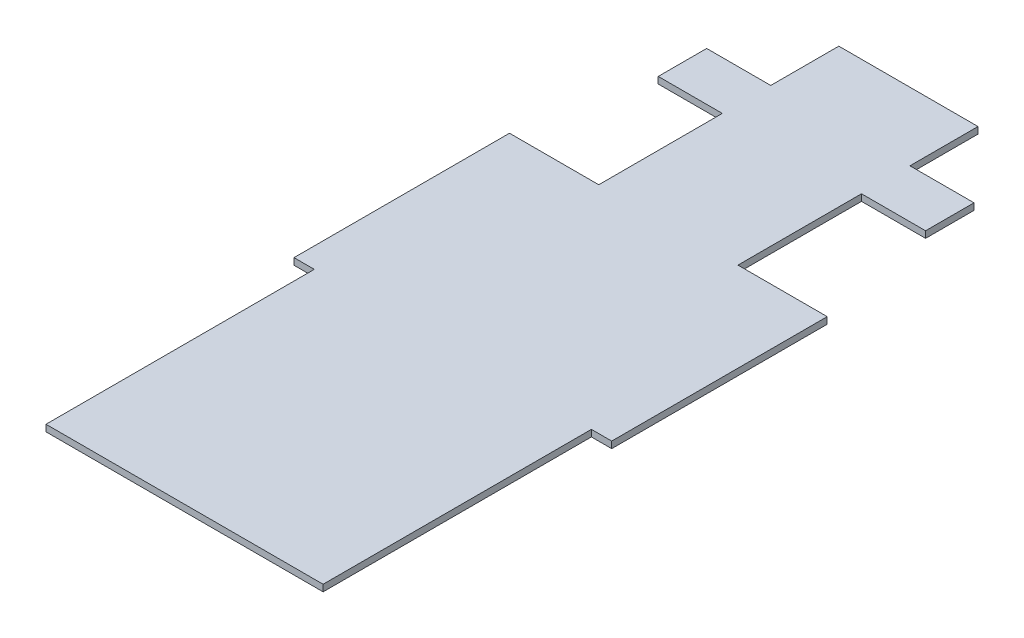
ISO-10303-21;
HEADER;
FILE_DESCRIPTION(('STEP AP214'),'2;1');
FILE_NAME('part.step','',(''),(''),'','','');
FILE_SCHEMA(('AUTOMOTIVE_DESIGN { 1 0 10303 214 1 1 1 1 }'));
ENDSEC;
DATA;
#1=APPLICATION_CONTEXT('core data for automotive mechanical design processes');
#2=APPLICATION_PROTOCOL_DEFINITION('international standard','automotive_design',2000,#1);
#3=PRODUCT_CONTEXT('',#1,'mechanical');
#4=PRODUCT('Part','Part','',(#3));
#5=PRODUCT_RELATED_PRODUCT_CATEGORY('part','',(#4));
#6=PRODUCT_DEFINITION_FORMATION('','',#4);
#7=PRODUCT_DEFINITION_CONTEXT('part definition',#1,'design');
#8=PRODUCT_DEFINITION('design','',#6,#7);
#9=PRODUCT_DEFINITION_SHAPE('','',#8);
#10=(LENGTH_UNIT() NAMED_UNIT(*) SI_UNIT(.MILLI.,.METRE.));
#11=(NAMED_UNIT(*) PLANE_ANGLE_UNIT() SI_UNIT($,.RADIAN.));
#12=(NAMED_UNIT(*) SI_UNIT($,.STERADIAN.) SOLID_ANGLE_UNIT());
#13=UNCERTAINTY_MEASURE_WITH_UNIT(LENGTH_MEASURE(1.E-05),#10,'distance_accuracy_value','');
#14=(GEOMETRIC_REPRESENTATION_CONTEXT(3) GLOBAL_UNCERTAINTY_ASSIGNED_CONTEXT((#13)) GLOBAL_UNIT_ASSIGNED_CONTEXT((#10,
#11,#12)) REPRESENTATION_CONTEXT('',''));
#15=CARTESIAN_POINT('',(0.,0.,0.));
#16=DIRECTION('',(0.,0.,1.));
#17=DIRECTION('',(1.,0.,0.));
#18=AXIS2_PLACEMENT_3D('',#15,#16,#17);
#19=CARTESIAN_POINT('',(-45.,1.87,30.525));
#20=DIRECTION('',(0.,0.,-1.));
#21=DIRECTION('',(-1.,0.,0.));
#22=AXIS2_PLACEMENT_3D('',#19,#20,#21);
#23=PLANE('',#22);
#24=DIRECTION('',(1.,0.,0.));
#25=VECTOR('',#24,1.);
#26=CARTESIAN_POINT('',(-45.,0.,30.525));
#27=LINE('',#26,#25);
#28=CARTESIAN_POINT('',(-45.,0.,30.525));
#29=VERTEX_POINT('',#28);
#30=CARTESIAN_POINT('',(-39.25,0.,30.525));
#31=VERTEX_POINT('',#30);
#32=EDGE_CURVE('E199',#29,#31,#27,.T.);
#33=ORIENTED_EDGE('',*,*,#32,.T.);
#34=DIRECTION('',(0.,-1.,0.));
#35=VECTOR('',#34,1.);
#36=CARTESIAN_POINT('',(-39.25,1.87,30.525));
#37=LINE('',#36,#35);
#38=CARTESIAN_POINT('',(-39.25,1.87,30.525));
#39=VERTEX_POINT('',#38);
#40=EDGE_CURVE('E11',#39,#31,#37,.T.);
#41=ORIENTED_EDGE('',*,*,#40,.F.);
#42=DIRECTION('',(1.,0.,0.));
#43=VECTOR('',#42,1.);
#44=CARTESIAN_POINT('',(-45.,1.87,30.525));
#45=LINE('',#44,#43);
#46=CARTESIAN_POINT('',(-45.,1.87,30.525));
#47=VERTEX_POINT('',#46);
#48=EDGE_CURVE('E122',#47,#39,#45,.T.);
#49=ORIENTED_EDGE('',*,*,#48,.F.);
#50=DIRECTION('',(0.,-1.,0.));
#51=VECTOR('',#50,1.);
#52=CARTESIAN_POINT('',(-45.,1.87,30.525));
#53=LINE('',#52,#51);
#54=EDGE_CURVE('E49',#47,#29,#53,.T.);
#55=ORIENTED_EDGE('',*,*,#54,.T.);
#56=EDGE_LOOP('',(#33,#41,#49,#55));
#57=FACE_BOUND('',#56,.T.);
#58=ADVANCED_FACE('F33',(#57),#23,.F.);
#59=CARTESIAN_POINT('',(-39.25,1.87,106.525));
#60=DIRECTION('',(-1.,0.,0.));
#61=DIRECTION('',(0.,0.,1.));
#62=AXIS2_PLACEMENT_3D('',#59,#60,#61);
#63=PLANE('',#62);
#64=DIRECTION('',(0.,0.,-1.));
#65=VECTOR('',#64,1.);
#66=CARTESIAN_POINT('',(-39.25,0.,106.525));
#67=LINE('',#66,#65);
#68=CARTESIAN_POINT('',(-39.25,0.,106.525));
#69=VERTEX_POINT('',#68);
#70=EDGE_CURVE('E201',#69,#31,#67,.T.);
#71=ORIENTED_EDGE('',*,*,#70,.F.);
#72=DIRECTION('',(0.,-1.,0.));
#73=VECTOR('',#72,1.);
#74=CARTESIAN_POINT('',(-39.25,1.87,106.525));
#75=LINE('',#74,#73);
#76=CARTESIAN_POINT('',(-39.25,1.87,106.525));
#77=VERTEX_POINT('',#76);
#78=EDGE_CURVE('E41',#77,#69,#75,.T.);
#79=ORIENTED_EDGE('',*,*,#78,.F.);
#80=DIRECTION('',(0.,0.,-1.));
#81=VECTOR('',#80,1.);
#82=CARTESIAN_POINT('',(-39.25,1.87,106.525));
#83=LINE('',#82,#81);
#84=EDGE_CURVE('E299',#77,#39,#83,.T.);
#85=ORIENTED_EDGE('',*,*,#84,.T.);
#86=ORIENTED_EDGE('',*,*,#40,.T.);
#87=EDGE_LOOP('',(#71,#79,#85,#86));
#88=FACE_BOUND('',#87,.T.);
#89=ADVANCED_FACE('F298',(#88),#63,.T.);
#90=CARTESIAN_POINT('',(-39.25,1.87,106.525));
#91=DIRECTION('',(0.,0.,-1.));
#92=DIRECTION('',(-1.,0.,0.));
#93=AXIS2_PLACEMENT_3D('',#90,#91,#92);
#94=PLANE('',#93);
#95=DIRECTION('',(1.,0.,0.));
#96=VECTOR('',#95,1.);
#97=CARTESIAN_POINT('',(-39.25,0.,106.525));
#98=LINE('',#97,#96);
#99=CARTESIAN_POINT('',(39.25,0.,106.525));
#100=VERTEX_POINT('',#99);
#101=EDGE_CURVE('E204',#69,#100,#98,.T.);
#102=ORIENTED_EDGE('',*,*,#101,.T.);
#103=DIRECTION('',(0.,-1.,0.));
#104=VECTOR('',#103,1.);
#105=CARTESIAN_POINT('',(39.25,1.87,106.525));
#106=LINE('',#105,#104);
#107=CARTESIAN_POINT('',(39.25,1.87,106.525));
#108=VERTEX_POINT('',#107);
#109=EDGE_CURVE('E283',#108,#100,#106,.T.);
#110=ORIENTED_EDGE('',*,*,#109,.F.);
#111=DIRECTION('',(1.,0.,0.));
#112=VECTOR('',#111,1.);
#113=CARTESIAN_POINT('',(-39.25,1.87,106.525));
#114=LINE('',#113,#112);
#115=EDGE_CURVE('E290',#77,#108,#114,.T.);
#116=ORIENTED_EDGE('',*,*,#115,.F.);
#117=ORIENTED_EDGE('',*,*,#78,.T.);
#118=EDGE_LOOP('',(#102,#110,#116,#117));
#119=FACE_BOUND('',#118,.T.);
#120=ADVANCED_FACE('F288',(#119),#94,.F.);
#121=CARTESIAN_POINT('',(39.25,1.87,106.525));
#122=DIRECTION('',(-1.,0.,0.));
#123=DIRECTION('',(0.,0.,1.));
#124=AXIS2_PLACEMENT_3D('',#121,#122,#123);
#125=PLANE('',#124);
#126=DIRECTION('',(0.,0.,-1.));
#127=VECTOR('',#126,1.);
#128=CARTESIAN_POINT('',(39.25,0.,106.525));
#129=LINE('',#128,#127);
#130=CARTESIAN_POINT('',(39.25,0.,30.525));
#131=VERTEX_POINT('',#130);
#132=EDGE_CURVE('E206',#100,#131,#129,.T.);
#133=ORIENTED_EDGE('',*,*,#132,.T.);
#134=DIRECTION('',(0.,-1.,0.));
#135=VECTOR('',#134,1.);
#136=CARTESIAN_POINT('',(39.25,1.87,30.525));
#137=LINE('',#136,#135);
#138=CARTESIAN_POINT('',(39.25,1.87,30.525));
#139=VERTEX_POINT('',#138);
#140=EDGE_CURVE('E280',#139,#131,#137,.T.);
#141=ORIENTED_EDGE('',*,*,#140,.F.);
#142=DIRECTION('',(0.,0.,-1.));
#143=VECTOR('',#142,1.);
#144=CARTESIAN_POINT('',(39.25,1.87,106.525));
#145=LINE('',#144,#143);
#146=EDGE_CURVE('E550',#108,#139,#145,.T.);
#147=ORIENTED_EDGE('',*,*,#146,.F.);
#148=ORIENTED_EDGE('',*,*,#109,.T.);
#149=EDGE_LOOP('',(#133,#141,#147,#148));
#150=FACE_BOUND('',#149,.T.);
#151=ADVANCED_FACE('F317',(#150),#125,.F.);
#152=CARTESIAN_POINT('',(39.25,1.87,30.525));
#153=DIRECTION('',(0.,0.,-1.));
#154=DIRECTION('',(-1.,0.,0.));
#155=AXIS2_PLACEMENT_3D('',#152,#153,#154);
#156=PLANE('',#155);
#157=DIRECTION('',(1.,0.,0.));
#158=VECTOR('',#157,1.);
#159=CARTESIAN_POINT('',(39.25,0.,30.525));
#160=LINE('',#159,#158);
#161=CARTESIAN_POINT('',(45.,0.,30.525));
#162=VERTEX_POINT('',#161);
#163=EDGE_CURVE('E208',#131,#162,#160,.T.);
#164=ORIENTED_EDGE('',*,*,#163,.T.);
#165=DIRECTION('',(0.,-1.,0.));
#166=VECTOR('',#165,1.);
#167=CARTESIAN_POINT('',(45.,1.87,30.525));
#168=LINE('',#167,#166);
#169=CARTESIAN_POINT('',(45.,1.87,30.525));
#170=VERTEX_POINT('',#169);
#171=EDGE_CURVE('E277',#170,#162,#168,.T.);
#172=ORIENTED_EDGE('',*,*,#171,.F.);
#173=DIRECTION('',(1.,0.,0.));
#174=VECTOR('',#173,1.);
#175=CARTESIAN_POINT('',(39.25,1.87,30.525));
#176=LINE('',#175,#174);
#177=EDGE_CURVE('E547',#139,#170,#176,.T.);
#178=ORIENTED_EDGE('',*,*,#177,.F.);
#179=ORIENTED_EDGE('',*,*,#140,.T.);
#180=EDGE_LOOP('',(#164,#172,#178,#179));
#181=FACE_BOUND('',#180,.T.);
#182=ADVANCED_FACE('F322',(#181),#156,.F.);
#183=CARTESIAN_POINT('',(45.,1.87,30.525));
#184=DIRECTION('',(-1.,0.,0.));
#185=DIRECTION('',(0.,0.,1.));
#186=AXIS2_PLACEMENT_3D('',#183,#184,#185);
#187=PLANE('',#186);
#188=DIRECTION('',(0.,0.,-1.));
#189=VECTOR('',#188,1.);
#190=CARTESIAN_POINT('',(45.,0.,30.525));
#191=LINE('',#190,#189);
#192=CARTESIAN_POINT('',(45.,0.,-30.525));
#193=VERTEX_POINT('',#192);
#194=EDGE_CURVE('E210',#162,#193,#191,.T.);
#195=ORIENTED_EDGE('',*,*,#194,.T.);
#196=DIRECTION('',(0.,-1.,0.));
#197=VECTOR('',#196,1.);
#198=CARTESIAN_POINT('',(45.,1.87,-30.525));
#199=LINE('',#198,#197);
#200=CARTESIAN_POINT('',(45.,1.87,-30.525));
#201=VERTEX_POINT('',#200);
#202=EDGE_CURVE('E275',#201,#193,#199,.T.);
#203=ORIENTED_EDGE('',*,*,#202,.F.);
#204=DIRECTION('',(0.,0.,-1.));
#205=VECTOR('',#204,1.);
#206=CARTESIAN_POINT('',(45.,1.87,30.525));
#207=LINE('',#206,#205);
#208=EDGE_CURVE('E545',#170,#201,#207,.T.);
#209=ORIENTED_EDGE('',*,*,#208,.F.);
#210=ORIENTED_EDGE('',*,*,#171,.T.);
#211=EDGE_LOOP('',(#195,#203,#209,#210));
#212=FACE_BOUND('',#211,.T.);
#213=ADVANCED_FACE('F326',(#212),#187,.F.);
#214=CARTESIAN_POINT('',(19.715,1.87,-30.525));
#215=DIRECTION('',(0.,0.,-1.));
#216=DIRECTION('',(-1.,0.,0.));
#217=AXIS2_PLACEMENT_3D('',#214,#215,#216);
#218=PLANE('',#217);
#219=DIRECTION('',(1.,0.,0.));
#220=VECTOR('',#219,1.);
#221=CARTESIAN_POINT('',(19.715,0.,-30.525));
#222=LINE('',#221,#220);
#223=CARTESIAN_POINT('',(19.715,0.,-30.525));
#224=VERTEX_POINT('',#223);
#225=EDGE_CURVE('E213',#224,#193,#222,.T.);
#226=ORIENTED_EDGE('',*,*,#225,.F.);
#227=DIRECTION('',(0.,-1.,0.));
#228=VECTOR('',#227,1.);
#229=CARTESIAN_POINT('',(19.715,1.87,-30.525));
#230=LINE('',#229,#228);
#231=CARTESIAN_POINT('',(19.715,1.87,-30.525));
#232=VERTEX_POINT('',#231);
#233=EDGE_CURVE('E273',#232,#224,#230,.T.);
#234=ORIENTED_EDGE('',*,*,#233,.F.);
#235=DIRECTION('',(1.,0.,0.));
#236=VECTOR('',#235,1.);
#237=CARTESIAN_POINT('',(19.715,1.87,-30.525));
#238=LINE('',#237,#236);
#239=EDGE_CURVE('E542',#232,#201,#238,.T.);
#240=ORIENTED_EDGE('',*,*,#239,.T.);
#241=ORIENTED_EDGE('',*,*,#202,.T.);
#242=EDGE_LOOP('',(#226,#234,#240,#241));
#243=FACE_BOUND('',#242,.T.);
#244=ADVANCED_FACE('F330',(#243),#218,.T.);
#245=CARTESIAN_POINT('',(19.715,1.87,-65.525));
#246=DIRECTION('',(1.,0.,0.));
#247=DIRECTION('',(0.,0.,-1.));
#248=AXIS2_PLACEMENT_3D('',#245,#246,#247);
#249=PLANE('',#248);
#250=DIRECTION('',(0.,0.,1.));
#251=VECTOR('',#250,1.);
#252=CARTESIAN_POINT('',(19.715,0.,-65.525));
#253=LINE('',#252,#251);
#254=CARTESIAN_POINT('',(19.715,0.,-65.525));
#255=VERTEX_POINT('',#254);
#256=EDGE_CURVE('E216',#255,#224,#253,.T.);
#257=ORIENTED_EDGE('',*,*,#256,.F.);
#258=DIRECTION('',(0.,-1.,0.));
#259=VECTOR('',#258,1.);
#260=CARTESIAN_POINT('',(19.715,1.87,-65.525));
#261=LINE('',#260,#259);
#262=CARTESIAN_POINT('',(19.715,1.87,-65.525));
#263=VERTEX_POINT('',#262);
#264=EDGE_CURVE('E271',#263,#255,#261,.T.);
#265=ORIENTED_EDGE('',*,*,#264,.F.);
#266=DIRECTION('',(0.,0.,1.));
#267=VECTOR('',#266,1.);
#268=CARTESIAN_POINT('',(19.715,1.87,-65.525));
#269=LINE('',#268,#267);
#270=EDGE_CURVE('E558',#263,#232,#269,.T.);
#271=ORIENTED_EDGE('',*,*,#270,.T.);
#272=ORIENTED_EDGE('',*,*,#233,.T.);
#273=EDGE_LOOP('',(#257,#265,#271,#272));
#274=FACE_BOUND('',#273,.T.);
#275=ADVANCED_FACE('F334',(#274),#249,.T.);
#276=CARTESIAN_POINT('',(37.865,1.87,-65.525));
#277=DIRECTION('',(0.,0.,1.));
#278=DIRECTION('',(1.,0.,0.));
#279=AXIS2_PLACEMENT_3D('',#276,#277,#278);
#280=PLANE('',#279);
#281=DIRECTION('',(-1.,0.,0.));
#282=VECTOR('',#281,1.);
#283=CARTESIAN_POINT('',(37.865,0.,-65.525));
#284=LINE('',#283,#282);
#285=CARTESIAN_POINT('',(37.865,0.,-65.525));
#286=VERTEX_POINT('',#285);
#287=EDGE_CURVE('E219',#286,#255,#284,.T.);
#288=ORIENTED_EDGE('',*,*,#287,.F.);
#289=DIRECTION('',(0.,-1.,0.));
#290=VECTOR('',#289,1.);
#291=CARTESIAN_POINT('',(37.865,1.87,-65.525));
#292=LINE('',#291,#290);
#293=CARTESIAN_POINT('',(37.865,1.87,-65.525));
#294=VERTEX_POINT('',#293);
#295=EDGE_CURVE('E269',#294,#286,#292,.T.);
#296=ORIENTED_EDGE('',*,*,#295,.F.);
#297=DIRECTION('',(-1.,0.,0.));
#298=VECTOR('',#297,1.);
#299=CARTESIAN_POINT('',(37.865,1.87,-65.525));
#300=LINE('',#299,#298);
#301=EDGE_CURVE('E534',#294,#263,#300,.T.);
#302=ORIENTED_EDGE('',*,*,#301,.T.);
#303=ORIENTED_EDGE('',*,*,#264,.T.);
#304=EDGE_LOOP('',(#288,#296,#302,#303));
#305=FACE_BOUND('',#304,.T.);
#306=ADVANCED_FACE('F338',(#305),#280,.T.);
#307=CARTESIAN_POINT('',(37.865,1.87,-79.245));
#308=DIRECTION('',(1.,0.,0.));
#309=DIRECTION('',(0.,0.,-1.));
#310=AXIS2_PLACEMENT_3D('',#307,#308,#309);
#311=PLANE('',#310);
#312=DIRECTION('',(0.,0.,1.));
#313=VECTOR('',#312,1.);
#314=CARTESIAN_POINT('',(37.865,0.,-79.245));
#315=LINE('',#314,#313);
#316=CARTESIAN_POINT('',(37.865,0.,-79.245));
#317=VERTEX_POINT('',#316);
#318=EDGE_CURVE('E222',#317,#286,#315,.T.);
#319=ORIENTED_EDGE('',*,*,#318,.F.);
#320=DIRECTION('',(0.,-1.,0.));
#321=VECTOR('',#320,1.);
#322=CARTESIAN_POINT('',(37.865,1.87,-79.245));
#323=LINE('',#322,#321);
#324=CARTESIAN_POINT('',(37.865,1.87,-79.245));
#325=VERTEX_POINT('',#324);
#326=EDGE_CURVE('E267',#325,#317,#323,.T.);
#327=ORIENTED_EDGE('',*,*,#326,.F.);
#328=DIRECTION('',(0.,0.,1.));
#329=VECTOR('',#328,1.);
#330=CARTESIAN_POINT('',(37.865,1.87,-79.245));
#331=LINE('',#330,#329);
#332=EDGE_CURVE('E530',#325,#294,#331,.T.);
#333=ORIENTED_EDGE('',*,*,#332,.T.);
#334=ORIENTED_EDGE('',*,*,#295,.T.);
#335=EDGE_LOOP('',(#319,#327,#333,#334));
#336=FACE_BOUND('',#335,.T.);
#337=ADVANCED_FACE('F342',(#336),#311,.T.);
#338=CARTESIAN_POINT('',(19.715,1.87,-79.245));
#339=DIRECTION('',(0.,0.,-1.));
#340=DIRECTION('',(-1.,0.,0.));
#341=AXIS2_PLACEMENT_3D('',#338,#339,#340);
#342=PLANE('',#341);
#343=DIRECTION('',(1.,0.,0.));
#344=VECTOR('',#343,1.);
#345=CARTESIAN_POINT('',(19.715,0.,-79.245));
#346=LINE('',#345,#344);
#347=CARTESIAN_POINT('',(19.715,0.,-79.245));
#348=VERTEX_POINT('',#347);
#349=EDGE_CURVE('E225',#348,#317,#346,.T.);
#350=ORIENTED_EDGE('',*,*,#349,.F.);
#351=DIRECTION('',(0.,-1.,0.));
#352=VECTOR('',#351,1.);
#353=CARTESIAN_POINT('',(19.715,1.87,-79.245));
#354=LINE('',#353,#352);
#355=CARTESIAN_POINT('',(19.715,1.87,-79.245));
#356=VERTEX_POINT('',#355);
#357=EDGE_CURVE('E265',#356,#348,#354,.T.);
#358=ORIENTED_EDGE('',*,*,#357,.F.);
#359=DIRECTION('',(1.,0.,0.));
#360=VECTOR('',#359,1.);
#361=CARTESIAN_POINT('',(19.715,1.87,-79.245));
#362=LINE('',#361,#360);
#363=EDGE_CURVE('E562',#356,#325,#362,.T.);
#364=ORIENTED_EDGE('',*,*,#363,.T.);
#365=ORIENTED_EDGE('',*,*,#326,.T.);
#366=EDGE_LOOP('',(#350,#358,#364,#365));
#367=FACE_BOUND('',#366,.T.);
#368=ADVANCED_FACE('F346',(#367),#342,.T.);
#369=CARTESIAN_POINT('',(19.715,1.87,-98.525));
#370=DIRECTION('',(1.,0.,0.));
#371=DIRECTION('',(0.,0.,-1.));
#372=AXIS2_PLACEMENT_3D('',#369,#370,#371);
#373=PLANE('',#372);
#374=DIRECTION('',(0.,0.,1.));
#375=VECTOR('',#374,1.);
#376=CARTESIAN_POINT('',(19.715,0.,-98.525));
#377=LINE('',#376,#375);
#378=CARTESIAN_POINT('',(19.715,0.,-98.525));
#379=VERTEX_POINT('',#378);
#380=EDGE_CURVE('E228',#379,#348,#377,.T.);
#381=ORIENTED_EDGE('',*,*,#380,.F.);
#382=DIRECTION('',(0.,-1.,0.));
#383=VECTOR('',#382,1.);
#384=CARTESIAN_POINT('',(19.715,1.87,-98.525));
#385=LINE('',#384,#383);
#386=CARTESIAN_POINT('',(19.715,1.87,-98.525));
#387=VERTEX_POINT('',#386);
#388=EDGE_CURVE('E263',#387,#379,#385,.T.);
#389=ORIENTED_EDGE('',*,*,#388,.F.);
#390=DIRECTION('',(0.,0.,1.));
#391=VECTOR('',#390,1.);
#392=CARTESIAN_POINT('',(19.715,1.87,-98.525));
#393=LINE('',#392,#391);
#394=EDGE_CURVE('E523',#387,#356,#393,.T.);
#395=ORIENTED_EDGE('',*,*,#394,.T.);
#396=ORIENTED_EDGE('',*,*,#357,.T.);
#397=EDGE_LOOP('',(#381,#389,#395,#396));
#398=FACE_BOUND('',#397,.T.);
#399=ADVANCED_FACE('F350',(#398),#373,.T.);
#400=CARTESIAN_POINT('',(19.715,1.87,-98.525));
#401=DIRECTION('',(0.,0.,1.));
#402=DIRECTION('',(1.,0.,0.));
#403=AXIS2_PLACEMENT_3D('',#400,#401,#402);
#404=PLANE('',#403);
#405=DIRECTION('',(-1.,0.,0.));
#406=VECTOR('',#405,1.);
#407=CARTESIAN_POINT('',(19.715,0.,-98.525));
#408=LINE('',#407,#406);
#409=CARTESIAN_POINT('',(-19.715,0.,-98.525));
#410=VERTEX_POINT('',#409);
#411=EDGE_CURVE('E231',#379,#410,#408,.T.);
#412=ORIENTED_EDGE('',*,*,#411,.T.);
#413=DIRECTION('',(0.,-1.,0.));
#414=VECTOR('',#413,1.);
#415=CARTESIAN_POINT('',(-19.715,1.87,-98.525));
#416=LINE('',#415,#414);
#417=CARTESIAN_POINT('',(-19.715,1.87,-98.525));
#418=VERTEX_POINT('',#417);
#419=EDGE_CURVE('E261',#418,#410,#416,.T.);
#420=ORIENTED_EDGE('',*,*,#419,.F.);
#421=DIRECTION('',(-1.,0.,0.));
#422=VECTOR('',#421,1.);
#423=CARTESIAN_POINT('',(19.715,1.87,-98.525));
#424=LINE('',#423,#422);
#425=EDGE_CURVE('E565',#387,#418,#424,.T.);
#426=ORIENTED_EDGE('',*,*,#425,.F.);
#427=ORIENTED_EDGE('',*,*,#388,.T.);
#428=EDGE_LOOP('',(#412,#420,#426,#427));
#429=FACE_BOUND('',#428,.T.);
#430=ADVANCED_FACE('F354',(#429),#404,.F.);
#431=CARTESIAN_POINT('',(-19.715,1.87,-79.245));
#432=DIRECTION('',(-1.,0.,0.));
#433=DIRECTION('',(0.,0.,1.));
#434=AXIS2_PLACEMENT_3D('',#431,#432,#433);
#435=PLANE('',#434);
#436=DIRECTION('',(0.,0.,-1.));
#437=VECTOR('',#436,1.);
#438=CARTESIAN_POINT('',(-19.715,0.,-79.245));
#439=LINE('',#438,#437);
#440=CARTESIAN_POINT('',(-19.715,0.,-79.245));
#441=VERTEX_POINT('',#440);
#442=EDGE_CURVE('E234',#441,#410,#439,.T.);
#443=ORIENTED_EDGE('',*,*,#442,.F.);
#444=DIRECTION('',(0.,-1.,0.));
#445=VECTOR('',#444,1.);
#446=CARTESIAN_POINT('',(-19.715,1.87,-79.245));
#447=LINE('',#446,#445);
#448=CARTESIAN_POINT('',(-19.715,1.87,-79.245));
#449=VERTEX_POINT('',#448);
#450=EDGE_CURVE('E259',#449,#441,#447,.T.);
#451=ORIENTED_EDGE('',*,*,#450,.F.);
#452=DIRECTION('',(0.,0.,-1.));
#453=VECTOR('',#452,1.);
#454=CARTESIAN_POINT('',(-19.715,1.87,-79.245));
#455=LINE('',#454,#453);
#456=EDGE_CURVE('E515',#449,#418,#455,.T.);
#457=ORIENTED_EDGE('',*,*,#456,.T.);
#458=ORIENTED_EDGE('',*,*,#419,.T.);
#459=EDGE_LOOP('',(#443,#451,#457,#458));
#460=FACE_BOUND('',#459,.T.);
#461=ADVANCED_FACE('F358',(#460),#435,.T.);
#462=CARTESIAN_POINT('',(-19.715,1.87,-79.245));
#463=DIRECTION('',(0.,0.,1.));
#464=DIRECTION('',(1.,0.,0.));
#465=AXIS2_PLACEMENT_3D('',#462,#463,#464);
#466=PLANE('',#465);
#467=DIRECTION('',(-1.,0.,0.));
#468=VECTOR('',#467,1.);
#469=CARTESIAN_POINT('',(-19.715,0.,-79.245));
#470=LINE('',#469,#468);
#471=CARTESIAN_POINT('',(-37.865,0.,-79.245));
#472=VERTEX_POINT('',#471);
#473=EDGE_CURVE('E237',#441,#472,#470,.T.);
#474=ORIENTED_EDGE('',*,*,#473,.T.);
#475=DIRECTION('',(0.,-1.,0.));
#476=VECTOR('',#475,1.);
#477=CARTESIAN_POINT('',(-37.865,1.87,-79.245));
#478=LINE('',#477,#476);
#479=CARTESIAN_POINT('',(-37.865,1.87,-79.245));
#480=VERTEX_POINT('',#479);
#481=EDGE_CURVE('E256',#480,#472,#478,.T.);
#482=ORIENTED_EDGE('',*,*,#481,.F.);
#483=DIRECTION('',(-1.,0.,0.));
#484=VECTOR('',#483,1.);
#485=CARTESIAN_POINT('',(-19.715,1.87,-79.245));
#486=LINE('',#485,#484);
#487=EDGE_CURVE('E512',#449,#480,#486,.T.);
#488=ORIENTED_EDGE('',*,*,#487,.F.);
#489=ORIENTED_EDGE('',*,*,#450,.T.);
#490=EDGE_LOOP('',(#474,#482,#488,#489));
#491=FACE_BOUND('',#490,.T.);
#492=ADVANCED_FACE('F362',(#491),#466,.F.);
#493=CARTESIAN_POINT('',(-37.865,1.87,-79.245));
#494=DIRECTION('',(1.,0.,0.));
#495=DIRECTION('',(0.,0.,-1.));
#496=AXIS2_PLACEMENT_3D('',#493,#494,#495);
#497=PLANE('',#496);
#498=DIRECTION('',(0.,0.,1.));
#499=VECTOR('',#498,1.);
#500=CARTESIAN_POINT('',(-37.865,0.,-79.245));
#501=LINE('',#500,#499);
#502=CARTESIAN_POINT('',(-37.865,0.,-65.525));
#503=VERTEX_POINT('',#502);
#504=EDGE_CURVE('E239',#472,#503,#501,.T.);
#505=ORIENTED_EDGE('',*,*,#504,.T.);
#506=DIRECTION('',(0.,-1.,0.));
#507=VECTOR('',#506,1.);
#508=CARTESIAN_POINT('',(-37.865,1.87,-65.525));
#509=LINE('',#508,#507);
#510=CARTESIAN_POINT('',(-37.865,1.87,-65.525));
#511=VERTEX_POINT('',#510);
#512=EDGE_CURVE('E254',#511,#503,#509,.T.);
#513=ORIENTED_EDGE('',*,*,#512,.F.);
#514=DIRECTION('',(0.,0.,1.));
#515=VECTOR('',#514,1.);
#516=CARTESIAN_POINT('',(-37.865,1.87,-79.245));
#517=LINE('',#516,#515);
#518=EDGE_CURVE('E510',#480,#511,#517,.T.);
#519=ORIENTED_EDGE('',*,*,#518,.F.);
#520=ORIENTED_EDGE('',*,*,#481,.T.);
#521=EDGE_LOOP('',(#505,#513,#519,#520));
#522=FACE_BOUND('',#521,.T.);
#523=ADVANCED_FACE('F366',(#522),#497,.F.);
#524=CARTESIAN_POINT('',(-19.715,1.87,-65.525));
#525=DIRECTION('',(0.,0.,1.));
#526=DIRECTION('',(1.,0.,0.));
#527=AXIS2_PLACEMENT_3D('',#524,#525,#526);
#528=PLANE('',#527);
#529=DIRECTION('',(-1.,0.,0.));
#530=VECTOR('',#529,1.);
#531=CARTESIAN_POINT('',(-19.715,0.,-65.525));
#532=LINE('',#531,#530);
#533=CARTESIAN_POINT('',(-19.715,0.,-65.525));
#534=VERTEX_POINT('',#533);
#535=EDGE_CURVE('E242',#534,#503,#532,.T.);
#536=ORIENTED_EDGE('',*,*,#535,.F.);
#537=DIRECTION('',(0.,-1.,0.));
#538=VECTOR('',#537,1.);
#539=CARTESIAN_POINT('',(-19.715,1.87,-65.525));
#540=LINE('',#539,#538);
#541=CARTESIAN_POINT('',(-19.715,1.87,-65.525));
#542=VERTEX_POINT('',#541);
#543=EDGE_CURVE('E191',#542,#534,#540,.T.);
#544=ORIENTED_EDGE('',*,*,#543,.F.);
#545=DIRECTION('',(-1.,0.,0.));
#546=VECTOR('',#545,1.);
#547=CARTESIAN_POINT('',(-19.715,1.87,-65.525));
#548=LINE('',#547,#546);
#549=EDGE_CURVE('E181',#542,#511,#548,.T.);
#550=ORIENTED_EDGE('',*,*,#549,.T.);
#551=ORIENTED_EDGE('',*,*,#512,.T.);
#552=EDGE_LOOP('',(#536,#544,#550,#551));
#553=FACE_BOUND('',#552,.T.);
#554=ADVANCED_FACE('F370',(#553),#528,.T.);
#555=CARTESIAN_POINT('',(-19.715,1.87,-65.525));
#556=DIRECTION('',(1.,0.,0.));
#557=DIRECTION('',(0.,0.,-1.));
#558=AXIS2_PLACEMENT_3D('',#555,#556,#557);
#559=PLANE('',#558);
#560=DIRECTION('',(0.,0.,1.));
#561=VECTOR('',#560,1.);
#562=CARTESIAN_POINT('',(-19.715,0.,-65.525));
#563=LINE('',#562,#561);
#564=CARTESIAN_POINT('',(-19.715,0.,-30.525));
#565=VERTEX_POINT('',#564);
#566=EDGE_CURVE('E188',#534,#565,#563,.T.);
#567=ORIENTED_EDGE('',*,*,#566,.T.);
#568=DIRECTION('',(0.,-1.,0.));
#569=VECTOR('',#568,1.);
#570=CARTESIAN_POINT('',(-19.715,1.87,-30.525));
#571=LINE('',#570,#569);
#572=CARTESIAN_POINT('',(-19.715,1.87,-30.525));
#573=VERTEX_POINT('',#572);
#574=EDGE_CURVE('E185',#573,#565,#571,.T.);
#575=ORIENTED_EDGE('',*,*,#574,.F.);
#576=DIRECTION('',(0.,0.,1.));
#577=VECTOR('',#576,1.);
#578=CARTESIAN_POINT('',(-19.715,1.87,-65.525));
#579=LINE('',#578,#577);
#580=EDGE_CURVE('E175',#542,#573,#579,.T.);
#581=ORIENTED_EDGE('',*,*,#580,.F.);
#582=ORIENTED_EDGE('',*,*,#543,.T.);
#583=EDGE_LOOP('',(#567,#575,#581,#582));
#584=FACE_BOUND('',#583,.T.);
#585=ADVANCED_FACE('F186',(#584),#559,.F.);
#586=CARTESIAN_POINT('',(-45.,1.87,-30.525));
#587=DIRECTION('',(0.,0.,-1.));
#588=DIRECTION('',(-1.,0.,0.));
#589=AXIS2_PLACEMENT_3D('',#586,#587,#588);
#590=PLANE('',#589);
#591=DIRECTION('',(1.,0.,0.));
#592=VECTOR('',#591,1.);
#593=CARTESIAN_POINT('',(-45.,0.,-30.525));
#594=LINE('',#593,#592);
#595=CARTESIAN_POINT('',(-45.,0.,-30.525));
#596=VERTEX_POINT('',#595);
#597=EDGE_CURVE('E246',#596,#565,#594,.T.);
#598=ORIENTED_EDGE('',*,*,#597,.F.);
#599=DIRECTION('',(0.,-1.,0.));
#600=VECTOR('',#599,1.);
#601=CARTESIAN_POINT('',(-45.,1.87,-30.525));
#602=LINE('',#601,#600);
#603=CARTESIAN_POINT('',(-45.,1.87,-30.525));
#604=VERTEX_POINT('',#603);
#605=EDGE_CURVE('E110',#604,#596,#602,.T.);
#606=ORIENTED_EDGE('',*,*,#605,.F.);
#607=DIRECTION('',(1.,0.,0.));
#608=VECTOR('',#607,1.);
#609=CARTESIAN_POINT('',(-45.,1.87,-30.525));
#610=LINE('',#609,#608);
#611=EDGE_CURVE('E179',#604,#573,#610,.T.);
#612=ORIENTED_EDGE('',*,*,#611,.T.);
#613=ORIENTED_EDGE('',*,*,#574,.T.);
#614=EDGE_LOOP('',(#598,#606,#612,#613));
#615=FACE_BOUND('',#614,.T.);
#616=ADVANCED_FACE('F193',(#615),#590,.T.);
#617=CARTESIAN_POINT('',(-45.,1.87,30.525));
#618=DIRECTION('',(-1.,0.,0.));
#619=DIRECTION('',(0.,0.,1.));
#620=AXIS2_PLACEMENT_3D('',#617,#618,#619);
#621=PLANE('',#620);
#622=DIRECTION('',(0.,0.,-1.));
#623=VECTOR('',#622,1.);
#624=CARTESIAN_POINT('',(-45.,0.,30.525));
#625=LINE('',#624,#623);
#626=EDGE_CURVE('E248',#29,#596,#625,.T.);
#627=ORIENTED_EDGE('',*,*,#626,.F.);
#628=ORIENTED_EDGE('',*,*,#54,.F.);
#629=DIRECTION('',(0.,0.,-1.));
#630=VECTOR('',#629,1.);
#631=CARTESIAN_POINT('',(-45.,1.87,30.525));
#632=LINE('',#631,#630);
#633=EDGE_CURVE('E194',#47,#604,#632,.T.);
#634=ORIENTED_EDGE('',*,*,#633,.T.);
#635=ORIENTED_EDGE('',*,*,#605,.T.);
#636=EDGE_LOOP('',(#627,#628,#634,#635));
#637=FACE_BOUND('',#636,.T.);
#638=ADVANCED_FACE('F300',(#637),#621,.T.);
#639=CARTESIAN_POINT('',(0.,1.87,0.));
#640=DIRECTION('',(0.,1.,0.));
#641=DIRECTION('',(0.,0.,1.));
#642=AXIS2_PLACEMENT_3D('',#639,#640,#641);
#643=PLANE('',#642);
#644=ORIENTED_EDGE('',*,*,#48,.T.);
#645=ORIENTED_EDGE('',*,*,#84,.F.);
#646=ORIENTED_EDGE('',*,*,#115,.T.);
#647=ORIENTED_EDGE('',*,*,#146,.T.);
#648=ORIENTED_EDGE('',*,*,#177,.T.);
#649=ORIENTED_EDGE('',*,*,#208,.T.);
#650=ORIENTED_EDGE('',*,*,#239,.F.);
#651=ORIENTED_EDGE('',*,*,#270,.F.);
#652=ORIENTED_EDGE('',*,*,#301,.F.);
#653=ORIENTED_EDGE('',*,*,#332,.F.);
#654=ORIENTED_EDGE('',*,*,#363,.F.);
#655=ORIENTED_EDGE('',*,*,#394,.F.);
#656=ORIENTED_EDGE('',*,*,#425,.T.);
#657=ORIENTED_EDGE('',*,*,#456,.F.);
#658=ORIENTED_EDGE('',*,*,#487,.T.);
#659=ORIENTED_EDGE('',*,*,#518,.T.);
#660=ORIENTED_EDGE('',*,*,#549,.F.);
#661=ORIENTED_EDGE('',*,*,#580,.T.);
#662=ORIENTED_EDGE('',*,*,#611,.F.);
#663=ORIENTED_EDGE('',*,*,#633,.F.);
#664=EDGE_LOOP('',(#644,#645,#646,#647,#648,#649,#650,#651,#652,#653,#654,#655,#656,#657,#658,
#659,#660,#661,#662,#663));
#665=FACE_BOUND('',#664,.T.);
#666=ADVANCED_FACE('F177',(#665),#643,.T.);
#667=CARTESIAN_POINT('',(0.,0.,0.));
#668=DIRECTION('',(0.,1.,0.));
#669=DIRECTION('',(0.,0.,1.));
#670=AXIS2_PLACEMENT_3D('',#667,#668,#669);
#671=PLANE('',#670);
#672=ORIENTED_EDGE('',*,*,#32,.F.);
#673=ORIENTED_EDGE('',*,*,#626,.T.);
#674=ORIENTED_EDGE('',*,*,#597,.T.);
#675=ORIENTED_EDGE('',*,*,#566,.F.);
#676=ORIENTED_EDGE('',*,*,#535,.T.);
#677=ORIENTED_EDGE('',*,*,#504,.F.);
#678=ORIENTED_EDGE('',*,*,#473,.F.);
#679=ORIENTED_EDGE('',*,*,#442,.T.);
#680=ORIENTED_EDGE('',*,*,#411,.F.);
#681=ORIENTED_EDGE('',*,*,#380,.T.);
#682=ORIENTED_EDGE('',*,*,#349,.T.);
#683=ORIENTED_EDGE('',*,*,#318,.T.);
#684=ORIENTED_EDGE('',*,*,#287,.T.);
#685=ORIENTED_EDGE('',*,*,#256,.T.);
#686=ORIENTED_EDGE('',*,*,#225,.T.);
#687=ORIENTED_EDGE('',*,*,#194,.F.);
#688=ORIENTED_EDGE('',*,*,#163,.F.);
#689=ORIENTED_EDGE('',*,*,#132,.F.);
#690=ORIENTED_EDGE('',*,*,#101,.F.);
#691=ORIENTED_EDGE('',*,*,#70,.T.);
#692=EDGE_LOOP('',(#672,#673,#674,#675,#676,#677,#678,#679,#680,#681,#682,#683,#684,#685,#686,
#687,#688,#689,#690,#691));
#693=FACE_BOUND('',#692,.T.);
#694=ADVANCED_FACE('F296',(#693),#671,.F.);
#695=CLOSED_SHELL('',(#58,#89,#120,#151,#182,#213,#244,#275,#306,#337,#368,#399,#430,#461,#492,
#523,#554,#585,#616,#638,#666,#694));
#696=MANIFOLD_SOLID_BREP('B2',#695);
#697=ADVANCED_BREP_SHAPE_REPRESENTATION('',(#18,#696),#14);
#698=SHAPE_DEFINITION_REPRESENTATION(#9,#697);
ENDSEC;
END-ISO-10303-21;
